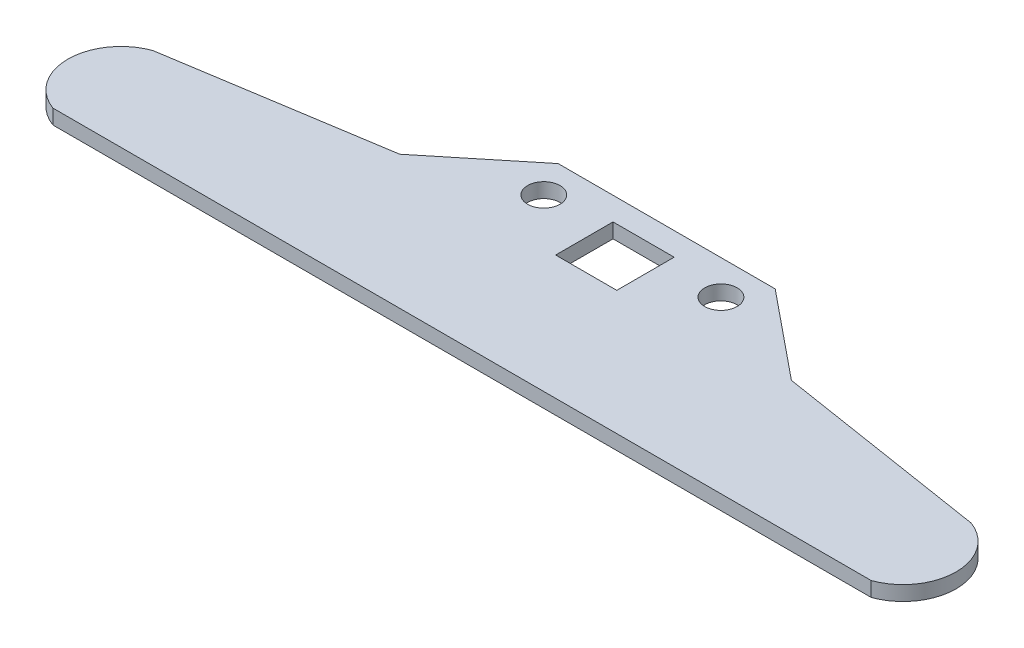
ISO-10303-21;
HEADER;
FILE_DESCRIPTION(('STEP AP214'),'2;1');
FILE_NAME('part.step','',(''),(''),'','','');
FILE_SCHEMA(('AUTOMOTIVE_DESIGN { 1 0 10303 214 1 1 1 1 }'));
ENDSEC;
DATA;
#1=APPLICATION_CONTEXT('core data for automotive mechanical design processes');
#2=APPLICATION_PROTOCOL_DEFINITION('international standard','automotive_design',2000,#1);
#3=PRODUCT_CONTEXT('',#1,'mechanical');
#4=PRODUCT('Part','Part','',(#3));
#5=PRODUCT_RELATED_PRODUCT_CATEGORY('part','',(#4));
#6=PRODUCT_DEFINITION_FORMATION('','',#4);
#7=PRODUCT_DEFINITION_CONTEXT('part definition',#1,'design');
#8=PRODUCT_DEFINITION('design','',#6,#7);
#9=PRODUCT_DEFINITION_SHAPE('','',#8);
#10=(LENGTH_UNIT() NAMED_UNIT(*) SI_UNIT(.MILLI.,.METRE.));
#11=(NAMED_UNIT(*) PLANE_ANGLE_UNIT() SI_UNIT($,.RADIAN.));
#12=(NAMED_UNIT(*) SI_UNIT($,.STERADIAN.) SOLID_ANGLE_UNIT());
#13=UNCERTAINTY_MEASURE_WITH_UNIT(LENGTH_MEASURE(1.E-05),#10,'distance_accuracy_value','');
#14=(GEOMETRIC_REPRESENTATION_CONTEXT(3) GLOBAL_UNCERTAINTY_ASSIGNED_CONTEXT((#13)) GLOBAL_UNIT_ASSIGNED_CONTEXT((#10,
#11,#12)) REPRESENTATION_CONTEXT('',''));
#15=CARTESIAN_POINT('',(0.,0.,0.));
#16=DIRECTION('',(0.,0.,1.));
#17=DIRECTION('',(1.,0.,0.));
#18=AXIS2_PLACEMENT_3D('',#15,#16,#17);
#19=CARTESIAN_POINT('',(-67.651388067537,2.54,-8.63175605327144));
#20=DIRECTION('',(0.,-1.,0.));
#21=DIRECTION('',(0.,0.,-1.));
#22=AXIS2_PLACEMENT_3D('',#19,#20,#21);
#23=PLANE('',#22);
#24=CARTESIAN_POINT('',(-15.321366994561,2.54,-29.4558675317969));
#25=DIRECTION('',(0.,1.,0.));
#26=DIRECTION('',(0.,0.,1.));
#27=AXIS2_PLACEMENT_3D('',#24,#25,#26);
#28=CIRCLE('',#27,2.80532071731399);
#29=CARTESIAN_POINT('',(-15.321366994561,2.54,-26.6505468144829));
#30=VERTEX_POINT('',#29);
#31=EDGE_CURVE('E151',#30,#30,#28,.T.);
#32=ORIENTED_EDGE('',*,*,#31,.F.);
#33=EDGE_LOOP('',(#32));
#34=FACE_BOUND('',#33,.T.);
#35=CARTESIAN_POINT('',(-67.651388067537,2.54,-8.63175605327144));
#36=DIRECTION('',(0.,1.,0.));
#37=DIRECTION('',(0.,0.,-1.));
#38=AXIS2_PLACEMENT_3D('',#35,#36,#37);
#39=CIRCLE('',#38,9.18139019778886);
#40=CARTESIAN_POINT('',(-70.7803996368452,2.54,-17.2635121065429));
#41=VERTEX_POINT('',#40);
#42=CARTESIAN_POINT('',(-70.7803996368452,2.54,0.));
#43=VERTEX_POINT('',#42);
#44=EDGE_CURVE('E161',#41,#43,#39,.T.);
#45=ORIENTED_EDGE('',*,*,#44,.T.);
#46=DIRECTION('',(1.,0.,0.));
#47=VECTOR('',#46,1.);
#48=CARTESIAN_POINT('',(70.7803996368452,2.54,0.));
#49=LINE('',#48,#47);
#50=CARTESIAN_POINT('',(70.7803996368452,2.54,0.));
#51=VERTEX_POINT('',#50);
#52=EDGE_CURVE('E164',#43,#51,#49,.T.);
#53=ORIENTED_EDGE('',*,*,#52,.T.);
#54=CARTESIAN_POINT('',(67.651388067537,2.54,-8.63175605327144));
#55=DIRECTION('',(0.,1.,0.));
#56=DIRECTION('',(0.,0.,1.));
#57=AXIS2_PLACEMENT_3D('',#54,#55,#56);
#58=CIRCLE('',#57,9.18139019778886);
#59=CARTESIAN_POINT('',(70.7803996368452,2.54,-17.2635121065429));
#60=VERTEX_POINT('',#59);
#61=EDGE_CURVE('E167',#51,#60,#58,.T.);
#62=ORIENTED_EDGE('',*,*,#61,.T.);
#63=DIRECTION('',(-0.987762965329069,0.,-0.155962573473011));
#64=VECTOR('',#63,1.);
#65=CARTESIAN_POINT('',(70.7803996368452,2.54,-17.2635121065429));
#66=LINE('',#65,#64);
#67=CARTESIAN_POINT('',(33.8796425090997,2.54,-23.0899474425027));
#68=VERTEX_POINT('',#67);
#69=EDGE_CURVE('E169',#60,#68,#66,.T.);
#70=ORIENTED_EDGE('',*,*,#69,.T.);
#71=DIRECTION('',(-0.775435860081924,0.,-0.631426343209567));
#72=VECTOR('',#71,1.);
#73=CARTESIAN_POINT('',(33.8796425090997,2.54,-23.0899474425027));
#74=LINE('',#73,#72);
#75=CARTESIAN_POINT('',(18.7740694158705,2.54,-35.3901998184179));
#76=VERTEX_POINT('',#75);
#77=EDGE_CURVE('E171',#68,#76,#74,.T.);
#78=ORIENTED_EDGE('',*,*,#77,.T.);
#79=DIRECTION('',(-1.,0.,0.));
#80=VECTOR('',#79,1.);
#81=CARTESIAN_POINT('',(-18.7740694158705,2.54,-35.3901998184179));
#82=LINE('',#81,#80);
#83=CARTESIAN_POINT('',(-18.7740694158705,2.54,-35.3901998184179));
#84=VERTEX_POINT('',#83);
#85=EDGE_CURVE('E173',#76,#84,#82,.T.);
#86=ORIENTED_EDGE('',*,*,#85,.T.);
#87=DIRECTION('',(-0.775435860081924,0.,0.631426343209567));
#88=VECTOR('',#87,1.);
#89=CARTESIAN_POINT('',(-33.8796425090997,2.54,-23.0899474425027));
#90=LINE('',#89,#88);
#91=CARTESIAN_POINT('',(-33.8796425090997,2.54,-23.0899474425027));
#92=VERTEX_POINT('',#91);
#93=EDGE_CURVE('E175',#84,#92,#90,.T.);
#94=ORIENTED_EDGE('',*,*,#93,.T.);
#95=DIRECTION('',(-0.987762965329069,0.,0.155962573473011));
#96=VECTOR('',#95,1.);
#97=CARTESIAN_POINT('',(-70.7803996368452,2.54,-17.2635121065429));
#98=LINE('',#97,#96);
#99=EDGE_CURVE('E177',#92,#41,#98,.T.);
#100=ORIENTED_EDGE('',*,*,#99,.T.);
#101=EDGE_LOOP('',(#45,#53,#62,#70,#78,#86,#94,#100));
#102=FACE_BOUND('',#101,.T.);
#103=DIRECTION('',(0.,0.,1.));
#104=VECTOR('',#103,1.);
#105=CARTESIAN_POINT('',(-5.28695058263021,2.54,-31.3980126437835));
#106=LINE('',#105,#104);
#107=CARTESIAN_POINT('',(-5.28695058263021,2.54,-31.3980126437835));
#108=VERTEX_POINT('',#107);
#109=CARTESIAN_POINT('',(-5.2869505826302,2.54,-21.4714931825186));
#110=VERTEX_POINT('',#109);
#111=EDGE_CURVE('E122',#108,#110,#106,.T.);
#112=ORIENTED_EDGE('',*,*,#111,.F.);
#113=DIRECTION('',(-1.,0.,0.));
#114=VECTOR('',#113,1.);
#115=CARTESIAN_POINT('',(-5.28695058263021,2.54,-31.3980126437835));
#116=LINE('',#115,#114);
#117=CARTESIAN_POINT('',(5.28695058263021,2.54,-31.3980126437835));
#118=VERTEX_POINT('',#117);
#119=EDGE_CURVE('E145',#118,#108,#116,.T.);
#120=ORIENTED_EDGE('',*,*,#119,.F.);
#121=DIRECTION('',(0.,0.,-1.));
#122=VECTOR('',#121,1.);
#123=CARTESIAN_POINT('',(5.28695058263021,2.54,-31.3980126437835));
#124=LINE('',#123,#122);
#125=CARTESIAN_POINT('',(5.2869505826302,2.54,-21.4714931825186));
#126=VERTEX_POINT('',#125);
#127=EDGE_CURVE('E143',#126,#118,#124,.T.);
#128=ORIENTED_EDGE('',*,*,#127,.F.);
#129=DIRECTION('',(1.,0.,0.));
#130=VECTOR('',#129,1.);
#131=CARTESIAN_POINT('',(-5.2869505826302,2.54,-21.4714931825186));
#132=LINE('',#131,#130);
#133=EDGE_CURVE('E130',#110,#126,#132,.T.);
#134=ORIENTED_EDGE('',*,*,#133,.F.);
#135=EDGE_LOOP('',(#112,#120,#128,#134));
#136=FACE_BOUND('',#135,.T.);
#137=CARTESIAN_POINT('',(15.3213669945608,2.54,-29.4558675317969));
#138=DIRECTION('',(0.,1.,0.));
#139=DIRECTION('',(0.,0.,-1.));
#140=AXIS2_PLACEMENT_3D('',#137,#138,#139);
#141=CIRCLE('',#140,2.80532071731399);
#142=CARTESIAN_POINT('',(15.3213669945608,2.54,-32.2611882491109));
#143=VERTEX_POINT('',#142);
#144=EDGE_CURVE('E302',#143,#143,#141,.T.);
#145=ORIENTED_EDGE('',*,*,#144,.F.);
#146=EDGE_LOOP('',(#145));
#147=FACE_BOUND('',#146,.T.);
#148=ADVANCED_FACE('F33',(#34,#102,#136,#147),#23,.F.);
#149=CARTESIAN_POINT('',(-67.651388067537,0.,-8.63175605327144));
#150=DIRECTION('',(0.,-1.,0.));
#151=DIRECTION('',(0.,0.,-1.));
#152=AXIS2_PLACEMENT_3D('',#149,#150,#151);
#153=PLANE('',#152);
#154=CARTESIAN_POINT('',(-15.321366994561,0.,-29.4558675317969));
#155=DIRECTION('',(0.,1.,0.));
#156=DIRECTION('',(0.,0.,1.));
#157=AXIS2_PLACEMENT_3D('',#154,#155,#156);
#158=CIRCLE('',#157,2.80532071731399);
#159=CARTESIAN_POINT('',(-15.321366994561,0.,-26.6505468144829));
#160=VERTEX_POINT('',#159);
#161=EDGE_CURVE('E308',#160,#160,#158,.T.);
#162=ORIENTED_EDGE('',*,*,#161,.T.);
#163=EDGE_LOOP('',(#162));
#164=FACE_BOUND('',#163,.T.);
#165=CARTESIAN_POINT('',(-67.651388067537,0.,-8.63175605327144));
#166=DIRECTION('',(0.,1.,0.));
#167=DIRECTION('',(0.,0.,-1.));
#168=AXIS2_PLACEMENT_3D('',#165,#166,#167);
#169=CIRCLE('',#168,9.18139019778886);
#170=CARTESIAN_POINT('',(-70.7803996368452,0.,-17.2635121065429));
#171=VERTEX_POINT('',#170);
#172=CARTESIAN_POINT('',(-70.7803996368452,0.,0.));
#173=VERTEX_POINT('',#172);
#174=EDGE_CURVE('E138',#171,#173,#169,.T.);
#175=ORIENTED_EDGE('',*,*,#174,.F.);
#176=DIRECTION('',(-0.987762965329069,0.,0.155962573473011));
#177=VECTOR('',#176,1.);
#178=CARTESIAN_POINT('',(-70.7803996368452,0.,-17.2635121065429));
#179=LINE('',#178,#177);
#180=CARTESIAN_POINT('',(-33.8796425090997,0.,-23.0899474425027));
#181=VERTEX_POINT('',#180);
#182=EDGE_CURVE('E165',#181,#171,#179,.T.);
#183=ORIENTED_EDGE('',*,*,#182,.F.);
#184=DIRECTION('',(-0.775435860081924,0.,0.631426343209567));
#185=VECTOR('',#184,1.);
#186=CARTESIAN_POINT('',(-33.8796425090997,0.,-23.0899474425027));
#187=LINE('',#186,#185);
#188=CARTESIAN_POINT('',(-18.7740694158705,0.,-35.3901998184179));
#189=VERTEX_POINT('',#188);
#190=EDGE_CURVE('E192',#189,#181,#187,.T.);
#191=ORIENTED_EDGE('',*,*,#190,.F.);
#192=DIRECTION('',(-1.,0.,0.));
#193=VECTOR('',#192,1.);
#194=CARTESIAN_POINT('',(-18.7740694158705,0.,-35.3901998184179));
#195=LINE('',#194,#193);
#196=CARTESIAN_POINT('',(18.7740694158705,0.,-35.3901998184179));
#197=VERTEX_POINT('',#196);
#198=EDGE_CURVE('E190',#197,#189,#195,.T.);
#199=ORIENTED_EDGE('',*,*,#198,.F.);
#200=DIRECTION('',(-0.775435860081924,0.,-0.631426343209567));
#201=VECTOR('',#200,1.);
#202=CARTESIAN_POINT('',(33.8796425090997,0.,-23.0899474425027));
#203=LINE('',#202,#201);
#204=CARTESIAN_POINT('',(33.8796425090997,0.,-23.0899474425027));
#205=VERTEX_POINT('',#204);
#206=EDGE_CURVE('E188',#205,#197,#203,.T.);
#207=ORIENTED_EDGE('',*,*,#206,.F.);
#208=DIRECTION('',(-0.987762965329069,0.,-0.155962573473011));
#209=VECTOR('',#208,1.);
#210=CARTESIAN_POINT('',(70.7803996368452,0.,-17.2635121065429));
#211=LINE('',#210,#209);
#212=CARTESIAN_POINT('',(70.7803996368452,0.,-17.2635121065429));
#213=VERTEX_POINT('',#212);
#214=EDGE_CURVE('E186',#213,#205,#211,.T.);
#215=ORIENTED_EDGE('',*,*,#214,.F.);
#216=CARTESIAN_POINT('',(67.651388067537,0.,-8.63175605327144));
#217=DIRECTION('',(0.,1.,0.));
#218=DIRECTION('',(0.,0.,1.));
#219=AXIS2_PLACEMENT_3D('',#216,#217,#218);
#220=CIRCLE('',#219,9.18139019778886);
#221=CARTESIAN_POINT('',(70.7803996368452,0.,0.));
#222=VERTEX_POINT('',#221);
#223=EDGE_CURVE('E184',#222,#213,#220,.T.);
#224=ORIENTED_EDGE('',*,*,#223,.F.);
#225=DIRECTION('',(1.,0.,0.));
#226=VECTOR('',#225,1.);
#227=CARTESIAN_POINT('',(70.7803996368452,0.,0.));
#228=LINE('',#227,#226);
#229=EDGE_CURVE('E182',#173,#222,#228,.T.);
#230=ORIENTED_EDGE('',*,*,#229,.F.);
#231=EDGE_LOOP('',(#175,#183,#191,#199,#207,#215,#224,#230));
#232=FACE_BOUND('',#231,.T.);
#233=DIRECTION('',(-1.,0.,0.));
#234=VECTOR('',#233,1.);
#235=CARTESIAN_POINT('',(-5.28695058263021,0.,-31.3980126437835));
#236=LINE('',#235,#234);
#237=CARTESIAN_POINT('',(5.28695058263021,0.,-31.3980126437835));
#238=VERTEX_POINT('',#237);
#239=CARTESIAN_POINT('',(-5.28695058263021,0.,-31.3980126437835));
#240=VERTEX_POINT('',#239);
#241=EDGE_CURVE('E131',#238,#240,#236,.T.);
#242=ORIENTED_EDGE('',*,*,#241,.T.);
#243=DIRECTION('',(0.,0.,1.));
#244=VECTOR('',#243,1.);
#245=CARTESIAN_POINT('',(-5.28695058263021,0.,-31.3980126437835));
#246=LINE('',#245,#244);
#247=CARTESIAN_POINT('',(-5.2869505826302,0.,-21.4714931825186));
#248=VERTEX_POINT('',#247);
#249=EDGE_CURVE('E56',#240,#248,#246,.T.);
#250=ORIENTED_EDGE('',*,*,#249,.T.);
#251=DIRECTION('',(1.,0.,0.));
#252=VECTOR('',#251,1.);
#253=CARTESIAN_POINT('',(-5.2869505826302,0.,-21.4714931825186));
#254=LINE('',#253,#252);
#255=CARTESIAN_POINT('',(5.2869505826302,0.,-21.4714931825186));
#256=VERTEX_POINT('',#255);
#257=EDGE_CURVE('E137',#248,#256,#254,.T.);
#258=ORIENTED_EDGE('',*,*,#257,.T.);
#259=DIRECTION('',(0.,0.,-1.));
#260=VECTOR('',#259,1.);
#261=CARTESIAN_POINT('',(5.28695058263021,0.,-31.3980126437835));
#262=LINE('',#261,#260);
#263=EDGE_CURVE('E153',#256,#238,#262,.T.);
#264=ORIENTED_EDGE('',*,*,#263,.T.);
#265=EDGE_LOOP('',(#242,#250,#258,#264));
#266=FACE_BOUND('',#265,.T.);
#267=CARTESIAN_POINT('',(15.3213669945608,0.,-29.4558675317969));
#268=DIRECTION('',(0.,1.,0.));
#269=DIRECTION('',(0.,0.,-1.));
#270=AXIS2_PLACEMENT_3D('',#267,#268,#269);
#271=CIRCLE('',#270,2.80532071731399);
#272=CARTESIAN_POINT('',(15.3213669945608,0.,-32.2611882491109));
#273=VERTEX_POINT('',#272);
#274=EDGE_CURVE('E305',#273,#273,#271,.T.);
#275=ORIENTED_EDGE('',*,*,#274,.T.);
#276=EDGE_LOOP('',(#275));
#277=FACE_BOUND('',#276,.T.);
#278=ADVANCED_FACE('F222',(#164,#232,#266,#277),#153,.T.);
#279=CARTESIAN_POINT('',(-67.651388067537,2.54,-8.63175605327144));
#280=DIRECTION('',(0.,-1.,0.));
#281=DIRECTION('',(0.,0.,-1.));
#282=AXIS2_PLACEMENT_3D('',#279,#280,#281);
#283=CYLINDRICAL_SURFACE('',#282,9.18139019778886);
#284=ORIENTED_EDGE('',*,*,#174,.T.);
#285=DIRECTION('',(0.,-1.,0.));
#286=VECTOR('',#285,1.);
#287=CARTESIAN_POINT('',(-70.7803996368452,2.54,0.));
#288=LINE('',#287,#286);
#289=EDGE_CURVE('E11',#43,#173,#288,.T.);
#290=ORIENTED_EDGE('',*,*,#289,.F.);
#291=ORIENTED_EDGE('',*,*,#44,.F.);
#292=DIRECTION('',(0.,-1.,0.));
#293=VECTOR('',#292,1.);
#294=CARTESIAN_POINT('',(-70.7803996368452,2.54,-17.2635121065429));
#295=LINE('',#294,#293);
#296=EDGE_CURVE('E179',#41,#171,#295,.T.);
#297=ORIENTED_EDGE('',*,*,#296,.T.);
#298=EDGE_LOOP('',(#284,#290,#291,#297));
#299=FACE_BOUND('',#298,.T.);
#300=ADVANCED_FACE('F35',(#299),#283,.T.);
#301=CARTESIAN_POINT('',(70.7803996368452,2.54,0.));
#302=DIRECTION('',(0.,0.,-1.));
#303=DIRECTION('',(-1.,0.,0.));
#304=AXIS2_PLACEMENT_3D('',#301,#302,#303);
#305=PLANE('',#304);
#306=ORIENTED_EDGE('',*,*,#229,.T.);
#307=DIRECTION('',(0.,-1.,0.));
#308=VECTOR('',#307,1.);
#309=CARTESIAN_POINT('',(70.7803996368452,2.54,0.));
#310=LINE('',#309,#308);
#311=EDGE_CURVE('E41',#51,#222,#310,.T.);
#312=ORIENTED_EDGE('',*,*,#311,.F.);
#313=ORIENTED_EDGE('',*,*,#52,.F.);
#314=ORIENTED_EDGE('',*,*,#289,.T.);
#315=EDGE_LOOP('',(#306,#312,#313,#314));
#316=FACE_BOUND('',#315,.T.);
#317=ADVANCED_FACE('F239',(#316),#305,.F.);
#318=CARTESIAN_POINT('',(67.651388067537,2.54,-8.63175605327144));
#319=DIRECTION('',(0.,-1.,0.));
#320=DIRECTION('',(0.,0.,-1.));
#321=AXIS2_PLACEMENT_3D('',#318,#319,#320);
#322=CYLINDRICAL_SURFACE('',#321,9.18139019778886);
#323=ORIENTED_EDGE('',*,*,#223,.T.);
#324=DIRECTION('',(0.,-1.,0.));
#325=VECTOR('',#324,1.);
#326=CARTESIAN_POINT('',(70.7803996368452,2.54,-17.2635121065429));
#327=LINE('',#326,#325);
#328=EDGE_CURVE('E209',#60,#213,#327,.T.);
#329=ORIENTED_EDGE('',*,*,#328,.F.);
#330=ORIENTED_EDGE('',*,*,#61,.F.);
#331=ORIENTED_EDGE('',*,*,#311,.T.);
#332=EDGE_LOOP('',(#323,#329,#330,#331));
#333=FACE_BOUND('',#332,.T.);
#334=ADVANCED_FACE('F216',(#333),#322,.T.);
#335=CARTESIAN_POINT('',(70.7803996368452,2.54,-17.2635121065429));
#336=DIRECTION('',(-0.155962573473011,0.,0.987762965329069));
#337=DIRECTION('',(0.987762965329069,0.,0.155962573473011));
#338=AXIS2_PLACEMENT_3D('',#335,#336,#337);
#339=PLANE('',#338);
#340=ORIENTED_EDGE('',*,*,#214,.T.);
#341=DIRECTION('',(0.,-1.,0.));
#342=VECTOR('',#341,1.);
#343=CARTESIAN_POINT('',(33.8796425090997,2.54,-23.0899474425027));
#344=LINE('',#343,#342);
#345=EDGE_CURVE('E206',#68,#205,#344,.T.);
#346=ORIENTED_EDGE('',*,*,#345,.F.);
#347=ORIENTED_EDGE('',*,*,#69,.F.);
#348=ORIENTED_EDGE('',*,*,#328,.T.);
#349=EDGE_LOOP('',(#340,#346,#347,#348));
#350=FACE_BOUND('',#349,.T.);
#351=ADVANCED_FACE('F228',(#350),#339,.F.);
#352=CARTESIAN_POINT('',(33.8796425090997,2.54,-23.0899474425027));
#353=DIRECTION('',(-0.631426343209567,0.,0.775435860081924));
#354=DIRECTION('',(0.775435860081925,0.,0.631426343209567));
#355=AXIS2_PLACEMENT_3D('',#352,#353,#354);
#356=PLANE('',#355);
#357=ORIENTED_EDGE('',*,*,#206,.T.);
#358=DIRECTION('',(0.,-1.,0.));
#359=VECTOR('',#358,1.);
#360=CARTESIAN_POINT('',(18.7740694158705,2.54,-35.3901998184179));
#361=LINE('',#360,#359);
#362=EDGE_CURVE('E203',#76,#197,#361,.T.);
#363=ORIENTED_EDGE('',*,*,#362,.F.);
#364=ORIENTED_EDGE('',*,*,#77,.F.);
#365=ORIENTED_EDGE('',*,*,#345,.T.);
#366=EDGE_LOOP('',(#357,#363,#364,#365));
#367=FACE_BOUND('',#366,.T.);
#368=ADVANCED_FACE('F232',(#367),#356,.F.);
#369=CARTESIAN_POINT('',(-18.7740694158705,2.54,-35.3901998184179));
#370=DIRECTION('',(0.,0.,1.));
#371=DIRECTION('',(1.,0.,0.));
#372=AXIS2_PLACEMENT_3D('',#369,#370,#371);
#373=PLANE('',#372);
#374=ORIENTED_EDGE('',*,*,#198,.T.);
#375=DIRECTION('',(0.,-1.,0.));
#376=VECTOR('',#375,1.);
#377=CARTESIAN_POINT('',(-18.7740694158705,2.54,-35.3901998184179));
#378=LINE('',#377,#376);
#379=EDGE_CURVE('E200',#84,#189,#378,.T.);
#380=ORIENTED_EDGE('',*,*,#379,.F.);
#381=ORIENTED_EDGE('',*,*,#85,.F.);
#382=ORIENTED_EDGE('',*,*,#362,.T.);
#383=EDGE_LOOP('',(#374,#380,#381,#382));
#384=FACE_BOUND('',#383,.T.);
#385=ADVANCED_FACE('F252',(#384),#373,.F.);
#386=CARTESIAN_POINT('',(-33.8796425090997,2.54,-23.0899474425027));
#387=DIRECTION('',(0.631426343209567,0.,0.775435860081924));
#388=DIRECTION('',(0.775435860081925,0.,-0.631426343209567));
#389=AXIS2_PLACEMENT_3D('',#386,#387,#388);
#390=PLANE('',#389);
#391=ORIENTED_EDGE('',*,*,#190,.T.);
#392=DIRECTION('',(0.,-1.,0.));
#393=VECTOR('',#392,1.);
#394=CARTESIAN_POINT('',(-33.8796425090997,2.54,-23.0899474425027));
#395=LINE('',#394,#393);
#396=EDGE_CURVE('E197',#92,#181,#395,.T.);
#397=ORIENTED_EDGE('',*,*,#396,.F.);
#398=ORIENTED_EDGE('',*,*,#93,.F.);
#399=ORIENTED_EDGE('',*,*,#379,.T.);
#400=EDGE_LOOP('',(#391,#397,#398,#399));
#401=FACE_BOUND('',#400,.T.);
#402=ADVANCED_FACE('F250',(#401),#390,.F.);
#403=CARTESIAN_POINT('',(-70.7803996368452,2.54,-17.2635121065429));
#404=DIRECTION('',(0.155962573473011,0.,0.987762965329069));
#405=DIRECTION('',(0.987762965329069,0.,-0.155962573473011));
#406=AXIS2_PLACEMENT_3D('',#403,#404,#405);
#407=PLANE('',#406);
#408=ORIENTED_EDGE('',*,*,#182,.T.);
#409=ORIENTED_EDGE('',*,*,#296,.F.);
#410=ORIENTED_EDGE('',*,*,#99,.F.);
#411=ORIENTED_EDGE('',*,*,#396,.T.);
#412=EDGE_LOOP('',(#408,#409,#410,#411));
#413=FACE_BOUND('',#412,.T.);
#414=ADVANCED_FACE('F245',(#413),#407,.F.);
#415=CARTESIAN_POINT('',(-5.28695058263021,2.54,-31.3980126437835));
#416=DIRECTION('',(1.,0.,0.));
#417=DIRECTION('',(0.,0.,-1.));
#418=AXIS2_PLACEMENT_3D('',#415,#416,#417);
#419=PLANE('',#418);
#420=ORIENTED_EDGE('',*,*,#249,.F.);
#421=DIRECTION('',(0.,-1.,0.));
#422=VECTOR('',#421,1.);
#423=CARTESIAN_POINT('',(-5.28695058263021,2.54,-31.3980126437835));
#424=LINE('',#423,#422);
#425=EDGE_CURVE('E126',#108,#240,#424,.T.);
#426=ORIENTED_EDGE('',*,*,#425,.F.);
#427=ORIENTED_EDGE('',*,*,#111,.T.);
#428=DIRECTION('',(0.,-1.,0.));
#429=VECTOR('',#428,1.);
#430=CARTESIAN_POINT('',(-5.2869505826302,2.54,-21.4714931825186));
#431=LINE('',#430,#429);
#432=EDGE_CURVE('E125',#110,#248,#431,.T.);
#433=ORIENTED_EDGE('',*,*,#432,.T.);
#434=EDGE_LOOP('',(#420,#426,#427,#433));
#435=FACE_BOUND('',#434,.T.);
#436=ADVANCED_FACE('F124',(#435),#419,.T.);
#437=CARTESIAN_POINT('',(-5.2869505826302,2.54,-21.4714931825186));
#438=DIRECTION('',(0.,0.,-1.));
#439=DIRECTION('',(-1.,0.,0.));
#440=AXIS2_PLACEMENT_3D('',#437,#438,#439);
#441=PLANE('',#440);
#442=ORIENTED_EDGE('',*,*,#257,.F.);
#443=ORIENTED_EDGE('',*,*,#432,.F.);
#444=ORIENTED_EDGE('',*,*,#133,.T.);
#445=DIRECTION('',(0.,-1.,0.));
#446=VECTOR('',#445,1.);
#447=CARTESIAN_POINT('',(5.2869505826302,2.54,-21.4714931825186));
#448=LINE('',#447,#446);
#449=EDGE_CURVE('E139',#126,#256,#448,.T.);
#450=ORIENTED_EDGE('',*,*,#449,.T.);
#451=EDGE_LOOP('',(#442,#443,#444,#450));
#452=FACE_BOUND('',#451,.T.);
#453=ADVANCED_FACE('F134',(#452),#441,.T.);
#454=CARTESIAN_POINT('',(5.28695058263021,2.54,-31.3980126437835));
#455=DIRECTION('',(-1.,0.,0.));
#456=DIRECTION('',(0.,0.,1.));
#457=AXIS2_PLACEMENT_3D('',#454,#455,#456);
#458=PLANE('',#457);
#459=ORIENTED_EDGE('',*,*,#263,.F.);
#460=ORIENTED_EDGE('',*,*,#449,.F.);
#461=ORIENTED_EDGE('',*,*,#127,.T.);
#462=DIRECTION('',(0.,-1.,0.));
#463=VECTOR('',#462,1.);
#464=CARTESIAN_POINT('',(5.28695058263021,2.54,-31.3980126437835));
#465=LINE('',#464,#463);
#466=EDGE_CURVE('E48',#118,#238,#465,.T.);
#467=ORIENTED_EDGE('',*,*,#466,.T.);
#468=EDGE_LOOP('',(#459,#460,#461,#467));
#469=FACE_BOUND('',#468,.T.);
#470=ADVANCED_FACE('F280',(#469),#458,.T.);
#471=CARTESIAN_POINT('',(-5.28695058263021,2.54,-31.3980126437835));
#472=DIRECTION('',(0.,0.,1.));
#473=DIRECTION('',(1.,0.,0.));
#474=AXIS2_PLACEMENT_3D('',#471,#472,#473);
#475=PLANE('',#474);
#476=ORIENTED_EDGE('',*,*,#241,.F.);
#477=ORIENTED_EDGE('',*,*,#466,.F.);
#478=ORIENTED_EDGE('',*,*,#119,.T.);
#479=ORIENTED_EDGE('',*,*,#425,.T.);
#480=EDGE_LOOP('',(#476,#477,#478,#479));
#481=FACE_BOUND('',#480,.T.);
#482=ADVANCED_FACE('F284',(#481),#475,.T.);
#483=CARTESIAN_POINT('',(-15.321366994561,2.54,-29.4558675317969));
#484=DIRECTION('',(0.,-1.,0.));
#485=DIRECTION('',(0.,0.,-1.));
#486=AXIS2_PLACEMENT_3D('',#483,#484,#485);
#487=CYLINDRICAL_SURFACE('',#486,2.80532071731399);
#488=ORIENTED_EDGE('',*,*,#31,.T.);
#489=EDGE_LOOP('',(#488));
#490=FACE_BOUND('',#489,.T.);
#491=ORIENTED_EDGE('',*,*,#161,.F.);
#492=EDGE_LOOP('',(#491));
#493=FACE_BOUND('',#492,.T.);
#494=ADVANCED_FACE('F290',(#490,#493),#487,.F.);
#495=CARTESIAN_POINT('',(15.3213669945608,2.54,-29.4558675317969));
#496=DIRECTION('',(0.,-1.,0.));
#497=DIRECTION('',(0.,0.,-1.));
#498=AXIS2_PLACEMENT_3D('',#495,#496,#497);
#499=CYLINDRICAL_SURFACE('',#498,2.80532071731399);
#500=ORIENTED_EDGE('',*,*,#144,.T.);
#501=EDGE_LOOP('',(#500));
#502=FACE_BOUND('',#501,.T.);
#503=ORIENTED_EDGE('',*,*,#274,.F.);
#504=EDGE_LOOP('',(#503));
#505=FACE_BOUND('',#504,.T.);
#506=ADVANCED_FACE('F293',(#502,#505),#499,.F.);
#507=CLOSED_SHELL('',(#148,#278,#300,#317,#334,#351,#368,#385,#402,#414,#436,#453,#470,#482,
#494,#506));
#508=MANIFOLD_SOLID_BREP('B2',#507);
#509=ADVANCED_BREP_SHAPE_REPRESENTATION('',(#18,#508),#14);
#510=SHAPE_DEFINITION_REPRESENTATION(#9,#509);
ENDSEC;
END-ISO-10303-21;
